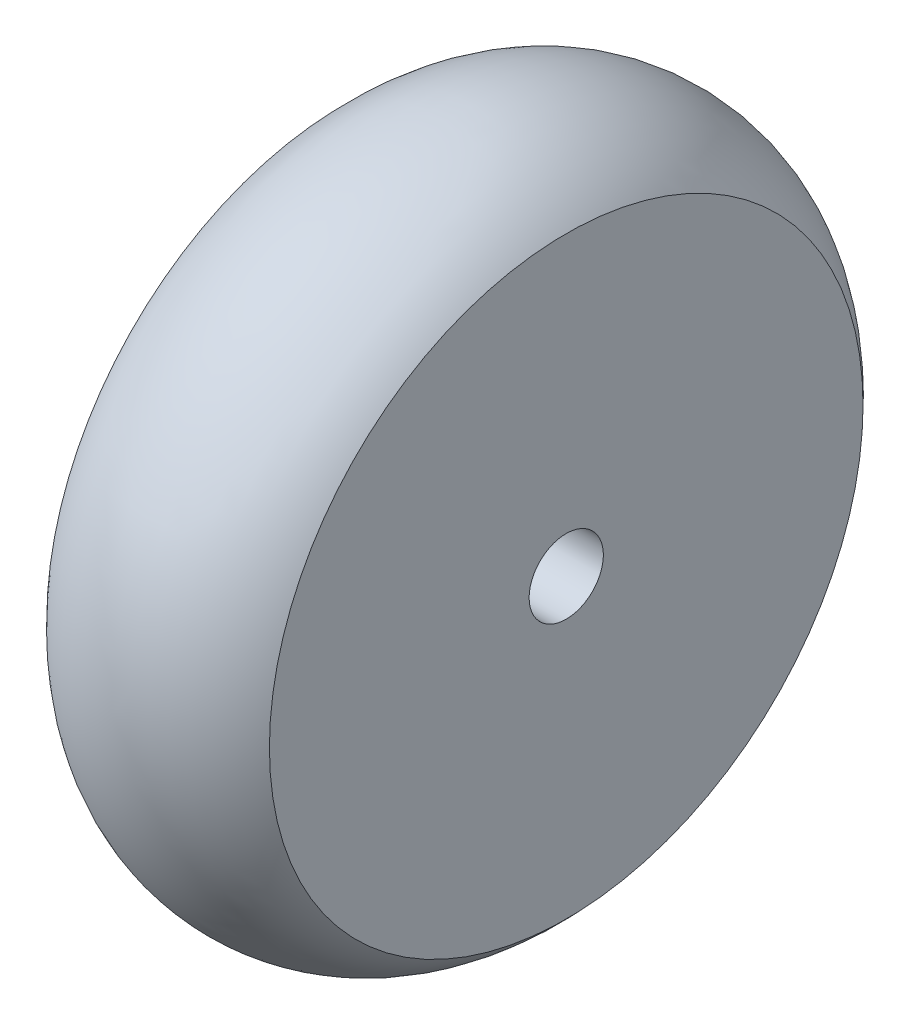
ISO-10303-21;
HEADER;
FILE_DESCRIPTION(('STEP AP214'),'2;1');
FILE_NAME('part.step','',(''),(''),'','','');
FILE_SCHEMA(('AUTOMOTIVE_DESIGN { 1 0 10303 214 1 1 1 1 }'));
ENDSEC;
DATA;
#1=APPLICATION_CONTEXT('core data for automotive mechanical design processes');
#2=APPLICATION_PROTOCOL_DEFINITION('international standard','automotive_design',2000,#1);
#3=PRODUCT_CONTEXT('',#1,'mechanical');
#4=PRODUCT('Part','Part','',(#3));
#5=PRODUCT_RELATED_PRODUCT_CATEGORY('part','',(#4));
#6=PRODUCT_DEFINITION_FORMATION('','',#4);
#7=PRODUCT_DEFINITION_CONTEXT('part definition',#1,'design');
#8=PRODUCT_DEFINITION('design','',#6,#7);
#9=PRODUCT_DEFINITION_SHAPE('','',#8);
#10=(LENGTH_UNIT() NAMED_UNIT(*) SI_UNIT(.MILLI.,.METRE.));
#11=(NAMED_UNIT(*) PLANE_ANGLE_UNIT() SI_UNIT($,.RADIAN.));
#12=(NAMED_UNIT(*) SI_UNIT($,.STERADIAN.) SOLID_ANGLE_UNIT());
#13=UNCERTAINTY_MEASURE_WITH_UNIT(LENGTH_MEASURE(1.E-05),#10,'distance_accuracy_value','');
#14=(GEOMETRIC_REPRESENTATION_CONTEXT(3) GLOBAL_UNCERTAINTY_ASSIGNED_CONTEXT((#13)) GLOBAL_UNIT_ASSIGNED_CONTEXT((#10,
#11,#12)) REPRESENTATION_CONTEXT('',''));
#15=CARTESIAN_POINT('',(0.,0.,0.));
#16=DIRECTION('',(0.,0.,1.));
#17=DIRECTION('',(1.,0.,0.));
#18=AXIS2_PLACEMENT_3D('',#15,#16,#17);
#19=CARTESIAN_POINT('',(-16.6103587344232,44.0593025408347,0.));
#20=DIRECTION('',(-1.,0.,0.));
#21=DIRECTION('',(0.,0.,1.));
#22=AXIS2_PLACEMENT_3D('',#19,#20,#21);
#23=PLANE('',#22);
#24=CARTESIAN_POINT('',(-16.6103587344232,44.0593025408347,0.));
#25=DIRECTION('',(-1.,0.,0.));
#26=DIRECTION('',(0.,0.,1.));
#27=AXIS2_PLACEMENT_3D('',#24,#25,#26);
#28=CIRCLE('',#27,2.5);
#29=CARTESIAN_POINT('',(-16.6103587344232,44.0593025408347,2.5));
#30=VERTEX_POINT('',#29);
#31=EDGE_CURVE('E45',#30,#30,#28,.T.);
#32=ORIENTED_EDGE('',*,*,#31,.F.);
#33=EDGE_LOOP('',(#32));
#34=FACE_BOUND('',#33,.T.);
#35=CARTESIAN_POINT('',(-16.6103587344232,44.0593025408347,0.));
#36=DIRECTION('',(1.,0.,0.));
#37=DIRECTION('',(0.,0.,-1.));
#38=AXIS2_PLACEMENT_3D('',#35,#36,#37);
#39=CIRCLE('',#38,20.);
#40=CARTESIAN_POINT('',(-16.6103587344232,44.0593025408347,-20.));
#41=VERTEX_POINT('',#40);
#42=EDGE_CURVE('E10',#41,#41,#39,.T.);
#43=ORIENTED_EDGE('',*,*,#42,.F.);
#44=EDGE_LOOP('',(#43));
#45=FACE_BOUND('',#44,.T.);
#46=ADVANCED_FACE('F31',(#34,#45),#23,.T.);
#47=CARTESIAN_POINT('',(-9.11035873442321,44.0593025408347,0.));
#48=DIRECTION('',(1.,0.,0.));
#49=DIRECTION('',(0.,0.,-1.));
#50=AXIS2_PLACEMENT_3D('',#47,#48,#49);
#51=TOROIDAL_SURFACE('',#50,13.3856217223385,10.);
#52=ORIENTED_EDGE('',*,*,#42,.T.);
#53=EDGE_LOOP('',(#52));
#54=FACE_BOUND('',#53,.T.);
#55=CARTESIAN_POINT('',(-1.61035873442321,44.0593025408347,0.));
#56=DIRECTION('',(1.,0.,0.));
#57=DIRECTION('',(0.,0.,-1.));
#58=AXIS2_PLACEMENT_3D('',#55,#56,#57);
#59=CIRCLE('',#58,20.);
#60=CARTESIAN_POINT('',(-1.61035873442321,44.0593025408347,-20.));
#61=VERTEX_POINT('',#60);
#62=EDGE_CURVE('E37',#61,#61,#59,.T.);
#63=ORIENTED_EDGE('',*,*,#62,.F.);
#64=EDGE_LOOP('',(#63));
#65=FACE_BOUND('',#64,.T.);
#66=ADVANCED_FACE('F55',(#54,#65),#51,.T.);
#67=CARTESIAN_POINT('',(-1.61035873442321,64.0593025408347,0.));
#68=DIRECTION('',(1.,0.,0.));
#69=DIRECTION('',(0.,0.,-1.));
#70=AXIS2_PLACEMENT_3D('',#67,#68,#69);
#71=PLANE('',#70);
#72=CARTESIAN_POINT('',(-1.61035873442321,44.0593025408347,0.));
#73=DIRECTION('',(-1.,0.,0.));
#74=DIRECTION('',(0.,0.,1.));
#75=AXIS2_PLACEMENT_3D('',#72,#73,#74);
#76=CIRCLE('',#75,2.5);
#77=CARTESIAN_POINT('',(-1.61035873442321,44.0593025408347,2.5));
#78=VERTEX_POINT('',#77);
#79=EDGE_CURVE('E41',#78,#78,#76,.T.);
#80=ORIENTED_EDGE('',*,*,#79,.T.);
#81=EDGE_LOOP('',(#80));
#82=FACE_BOUND('',#81,.T.);
#83=ORIENTED_EDGE('',*,*,#62,.T.);
#84=EDGE_LOOP('',(#83));
#85=FACE_BOUND('',#84,.T.);
#86=ADVANCED_FACE('F59',(#82,#85),#71,.T.);
#87=CARTESIAN_POINT('',(-1.61035873442321,44.0593025408347,0.));
#88=DIRECTION('',(-1.,0.,0.));
#89=DIRECTION('',(0.,0.,1.));
#90=AXIS2_PLACEMENT_3D('',#87,#88,#89);
#91=CYLINDRICAL_SURFACE('',#90,2.5);
#92=ORIENTED_EDGE('',*,*,#79,.F.);
#93=EDGE_LOOP('',(#92));
#94=FACE_BOUND('',#93,.T.);
#95=ORIENTED_EDGE('',*,*,#31,.T.);
#96=EDGE_LOOP('',(#95));
#97=FACE_BOUND('',#96,.T.);
#98=ADVANCED_FACE('F51',(#94,#97),#91,.F.);
#99=CLOSED_SHELL('',(#46,#66,#86,#98));
#100=MANIFOLD_SOLID_BREP('B2',#99);
#101=ADVANCED_BREP_SHAPE_REPRESENTATION('',(#18,#100),#14);
#102=SHAPE_DEFINITION_REPRESENTATION(#9,#101);
ENDSEC;
END-ISO-10303-21;
